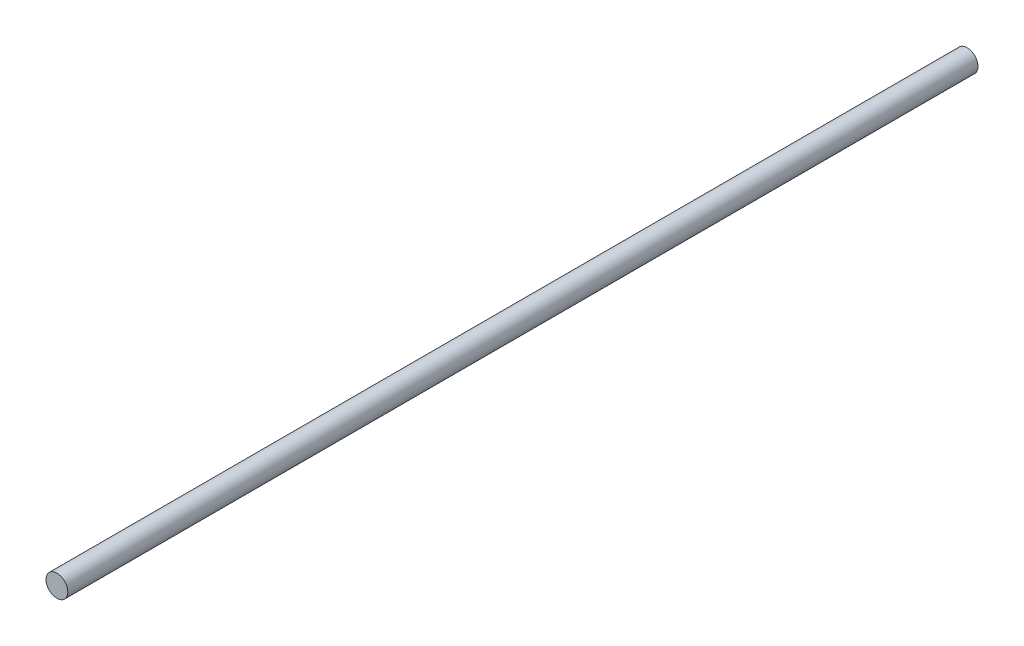
ISO-10303-21;
HEADER;
FILE_DESCRIPTION(('STEP AP214'),'2;1');
FILE_NAME('part.step','',(''),(''),'','','');
FILE_SCHEMA(('AUTOMOTIVE_DESIGN { 1 0 10303 214 1 1 1 1 }'));
ENDSEC;
DATA;
#1=APPLICATION_CONTEXT('core data for automotive mechanical design processes');
#2=APPLICATION_PROTOCOL_DEFINITION('international standard','automotive_design',2000,#1);
#3=PRODUCT_CONTEXT('',#1,'mechanical');
#4=PRODUCT('Part','Part','',(#3));
#5=PRODUCT_RELATED_PRODUCT_CATEGORY('part','',(#4));
#6=PRODUCT_DEFINITION_FORMATION('','',#4);
#7=PRODUCT_DEFINITION_CONTEXT('part definition',#1,'design');
#8=PRODUCT_DEFINITION('design','',#6,#7);
#9=PRODUCT_DEFINITION_SHAPE('','',#8);
#10=(LENGTH_UNIT() NAMED_UNIT(*) SI_UNIT(.MILLI.,.METRE.));
#11=(NAMED_UNIT(*) PLANE_ANGLE_UNIT() SI_UNIT($,.RADIAN.));
#12=(NAMED_UNIT(*) SI_UNIT($,.STERADIAN.) SOLID_ANGLE_UNIT());
#13=UNCERTAINTY_MEASURE_WITH_UNIT(LENGTH_MEASURE(1.E-05),#10,'distance_accuracy_value','');
#14=(GEOMETRIC_REPRESENTATION_CONTEXT(3) GLOBAL_UNCERTAINTY_ASSIGNED_CONTEXT((#13)) GLOBAL_UNIT_ASSIGNED_CONTEXT((#10,
#11,#12)) REPRESENTATION_CONTEXT('',''));
#15=CARTESIAN_POINT('',(0.,0.,0.));
#16=DIRECTION('',(0.,0.,1.));
#17=DIRECTION('',(1.,0.,0.));
#18=AXIS2_PLACEMENT_3D('',#15,#16,#17);
#19=CARTESIAN_POINT('',(0.,0.,1060.));
#20=DIRECTION('',(0.,0.,-1.));
#21=DIRECTION('',(-1.,0.,0.));
#22=AXIS2_PLACEMENT_3D('',#19,#20,#21);
#23=CYLINDRICAL_SURFACE('',#22,12.7);
#24=CARTESIAN_POINT('',(0.,0.,1060.));
#25=DIRECTION('',(0.,0.,1.));
#26=DIRECTION('',(1.,0.,0.));
#27=AXIS2_PLACEMENT_3D('',#24,#25,#26);
#28=CIRCLE('',#27,12.7);
#29=CARTESIAN_POINT('',(12.7,0.,1060.));
#30=VERTEX_POINT('',#29);
#31=EDGE_CURVE('E10',#30,#30,#28,.T.);
#32=ORIENTED_EDGE('',*,*,#31,.F.);
#33=EDGE_LOOP('',(#32));
#34=FACE_BOUND('',#33,.T.);
#35=CARTESIAN_POINT('',(0.,0.,0.));
#36=DIRECTION('',(0.,0.,1.));
#37=DIRECTION('',(1.,0.,0.));
#38=AXIS2_PLACEMENT_3D('',#35,#36,#37);
#39=CIRCLE('',#38,12.7);
#40=CARTESIAN_POINT('',(12.7,0.,0.));
#41=VERTEX_POINT('',#40);
#42=EDGE_CURVE('E38',#41,#41,#39,.T.);
#43=ORIENTED_EDGE('',*,*,#42,.T.);
#44=EDGE_LOOP('',(#43));
#45=FACE_BOUND('',#44,.T.);
#46=ADVANCED_FACE('F35',(#34,#45),#23,.T.);
#47=CARTESIAN_POINT('',(0.,0.,1060.));
#48=DIRECTION('',(0.,0.,1.));
#49=DIRECTION('',(1.,0.,0.));
#50=AXIS2_PLACEMENT_3D('',#47,#48,#49);
#51=PLANE('',#50);
#52=ORIENTED_EDGE('',*,*,#31,.T.);
#53=EDGE_LOOP('',(#52));
#54=FACE_BOUND('',#53,.T.);
#55=ADVANCED_FACE('F50',(#54),#51,.T.);
#56=CARTESIAN_POINT('',(0.,0.,0.));
#57=DIRECTION('',(0.,0.,1.));
#58=DIRECTION('',(1.,0.,0.));
#59=AXIS2_PLACEMENT_3D('',#56,#57,#58);
#60=PLANE('',#59);
#61=ORIENTED_EDGE('',*,*,#42,.F.);
#62=EDGE_LOOP('',(#61));
#63=FACE_BOUND('',#62,.T.);
#64=ADVANCED_FACE('F48',(#63),#60,.F.);
#65=CLOSED_SHELL('',(#46,#55,#64));
#66=MANIFOLD_SOLID_BREP('B2',#65);
#67=ADVANCED_BREP_SHAPE_REPRESENTATION('',(#18,#66),#14);
#68=SHAPE_DEFINITION_REPRESENTATION(#9,#67);
ENDSEC;
END-ISO-10303-21;
